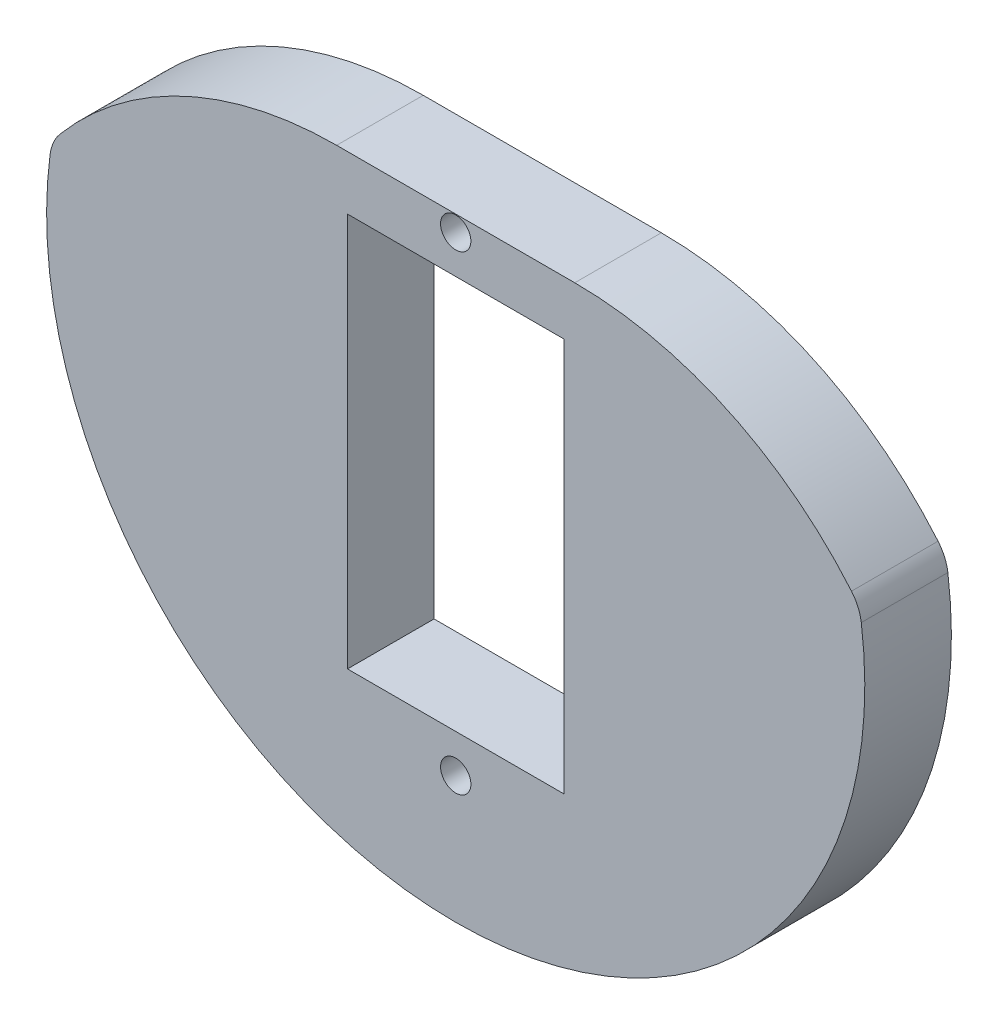
ISO-10303-21;
HEADER;
FILE_DESCRIPTION(('STEP AP214'),'2;1');
FILE_NAME('part.step','',(''),(''),'','','');
FILE_SCHEMA(('AUTOMOTIVE_DESIGN { 1 0 10303 214 1 1 1 1 }'));
ENDSEC;
DATA;
#1=APPLICATION_CONTEXT('core data for automotive mechanical design processes');
#2=APPLICATION_PROTOCOL_DEFINITION('international standard','automotive_design',2000,#1);
#3=PRODUCT_CONTEXT('',#1,'mechanical');
#4=PRODUCT('Part','Part','',(#3));
#5=PRODUCT_RELATED_PRODUCT_CATEGORY('part','',(#4));
#6=PRODUCT_DEFINITION_FORMATION('','',#4);
#7=PRODUCT_DEFINITION_CONTEXT('part definition',#1,'design');
#8=PRODUCT_DEFINITION('design','',#6,#7);
#9=PRODUCT_DEFINITION_SHAPE('','',#8);
#10=(LENGTH_UNIT() NAMED_UNIT(*) SI_UNIT(.MILLI.,.METRE.));
#11=(NAMED_UNIT(*) PLANE_ANGLE_UNIT() SI_UNIT($,.RADIAN.));
#12=(NAMED_UNIT(*) SI_UNIT($,.STERADIAN.) SOLID_ANGLE_UNIT());
#13=UNCERTAINTY_MEASURE_WITH_UNIT(LENGTH_MEASURE(1.E-05),#10,'distance_accuracy_value','');
#14=(GEOMETRIC_REPRESENTATION_CONTEXT(3) GLOBAL_UNCERTAINTY_ASSIGNED_CONTEXT((#13)) GLOBAL_UNIT_ASSIGNED_CONTEXT((#10,
#11,#12)) REPRESENTATION_CONTEXT('',''));
#15=CARTESIAN_POINT('',(0.,0.,0.));
#16=DIRECTION('',(0.,0.,1.));
#17=DIRECTION('',(1.,0.,0.));
#18=AXIS2_PLACEMENT_3D('',#15,#16,#17);
#19=CARTESIAN_POINT('',(6.985,-9.24256169381886,5.08));
#20=DIRECTION('',(0.,0.,-1.));
#21=DIRECTION('',(-1.,0.,0.));
#22=AXIS2_PLACEMENT_3D('',#19,#20,#21);
#23=CYLINDRICAL_SURFACE('',#22,21.2313616938189);
#24=CARTESIAN_POINT('',(6.985,-9.24256169381886,5.08));
#25=DIRECTION('',(0.,0.,1.));
#26=DIRECTION('',(-1.,0.,0.));
#27=AXIS2_PLACEMENT_3D('',#24,#25,#26);
#28=CIRCLE('',#27,21.2313616938189);
#29=CARTESIAN_POINT('',(23.2220252121452,4.43697527326889,5.08));
#30=VERTEX_POINT('',#29);
#31=CARTESIAN_POINT('',(6.985,11.9888,5.08));
#32=VERTEX_POINT('',#31);
#33=EDGE_CURVE('E170',#30,#32,#28,.T.);
#34=ORIENTED_EDGE('',*,*,#33,.F.);
#35=DIRECTION('',(0.,0.,-1.));
#36=VECTOR('',#35,1.);
#37=CARTESIAN_POINT('',(23.2220252121452,4.43697527326889,5.08));
#38=LINE('',#37,#36);
#39=CARTESIAN_POINT('',(23.2220252121452,4.43697527326889,0.));
#40=VERTEX_POINT('',#39);
#41=EDGE_CURVE('E11',#30,#40,#38,.T.);
#42=ORIENTED_EDGE('',*,*,#41,.T.);
#43=CARTESIAN_POINT('',(6.985,-9.24256169381886,0.));
#44=DIRECTION('',(0.,0.,1.));
#45=DIRECTION('',(-1.,0.,0.));
#46=AXIS2_PLACEMENT_3D('',#43,#44,#45);
#47=CIRCLE('',#46,21.2313616938189);
#48=CARTESIAN_POINT('',(6.985,11.9888,0.));
#49=VERTEX_POINT('',#48);
#50=EDGE_CURVE('E164',#40,#49,#47,.T.);
#51=ORIENTED_EDGE('',*,*,#50,.T.);
#52=DIRECTION('',(0.,0.,-1.));
#53=VECTOR('',#52,1.);
#54=CARTESIAN_POINT('',(6.985,11.9888,5.08));
#55=LINE('',#54,#53);
#56=EDGE_CURVE('E201',#32,#49,#55,.T.);
#57=ORIENTED_EDGE('',*,*,#56,.F.);
#58=EDGE_LOOP('',(#34,#42,#51,#57));
#59=FACE_BOUND('',#58,.T.);
#60=ADVANCED_FACE('F39',(#59),#23,.T.);
#61=CARTESIAN_POINT('',(-6.985,11.9888,5.08));
#62=DIRECTION('',(0.,-1.,0.));
#63=DIRECTION('',(0.,0.,-1.));
#64=AXIS2_PLACEMENT_3D('',#61,#62,#63);
#65=PLANE('',#64);
#66=DIRECTION('',(-1.,0.,0.));
#67=VECTOR('',#66,1.);
#68=CARTESIAN_POINT('',(-6.985,11.9888,0.));
#69=LINE('',#68,#67);
#70=CARTESIAN_POINT('',(-6.985,11.9888,0.));
#71=VERTEX_POINT('',#70);
#72=EDGE_CURVE('E188',#49,#71,#69,.T.);
#73=ORIENTED_EDGE('',*,*,#72,.T.);
#74=DIRECTION('',(0.,0.,-1.));
#75=VECTOR('',#74,1.);
#76=CARTESIAN_POINT('',(-6.985,11.9888,5.08));
#77=LINE('',#76,#75);
#78=CARTESIAN_POINT('',(-6.985,11.9888,5.08));
#79=VERTEX_POINT('',#78);
#80=EDGE_CURVE('E185',#79,#71,#77,.T.);
#81=ORIENTED_EDGE('',*,*,#80,.F.);
#82=DIRECTION('',(-1.,0.,0.));
#83=VECTOR('',#82,1.);
#84=CARTESIAN_POINT('',(-6.985,11.9888,5.08));
#85=LINE('',#84,#83);
#86=EDGE_CURVE('E173',#32,#79,#85,.T.);
#87=ORIENTED_EDGE('',*,*,#86,.F.);
#88=ORIENTED_EDGE('',*,*,#56,.T.);
#89=EDGE_LOOP('',(#73,#81,#87,#88));
#90=FACE_BOUND('',#89,.T.);
#91=ADVANCED_FACE('F245',(#90),#65,.F.);
#92=CARTESIAN_POINT('',(-6.985,-9.24256169381886,5.08));
#93=DIRECTION('',(0.,0.,-1.));
#94=DIRECTION('',(-1.,0.,0.));
#95=AXIS2_PLACEMENT_3D('',#92,#93,#94);
#96=CYLINDRICAL_SURFACE('',#95,21.2313616938189);
#97=CARTESIAN_POINT('',(-6.985,-9.24256169381886,0.));
#98=DIRECTION('',(0.,0.,1.));
#99=DIRECTION('',(1.,0.,0.));
#100=AXIS2_PLACEMENT_3D('',#97,#98,#99);
#101=CIRCLE('',#100,21.2313616938189);
#102=CARTESIAN_POINT('',(-23.2220252121452,4.43697527326889,0.));
#103=VERTEX_POINT('',#102);
#104=EDGE_CURVE('E191',#71,#103,#101,.T.);
#105=ORIENTED_EDGE('',*,*,#104,.T.);
#106=DIRECTION('',(0.,0.,-1.));
#107=VECTOR('',#106,1.);
#108=CARTESIAN_POINT('',(-23.2220252121452,4.43697527326889,5.08));
#109=LINE('',#108,#107);
#110=CARTESIAN_POINT('',(-23.2220252121452,4.43697527326889,5.08));
#111=VERTEX_POINT('',#110);
#112=EDGE_CURVE('E218',#103,#111,#109,.F.);
#113=ORIENTED_EDGE('',*,*,#112,.T.);
#114=CARTESIAN_POINT('',(-6.985,-9.24256169381886,5.08));
#115=DIRECTION('',(0.,0.,1.));
#116=DIRECTION('',(1.,0.,0.));
#117=AXIS2_PLACEMENT_3D('',#114,#115,#116);
#118=CIRCLE('',#117,21.2313616938189);
#119=EDGE_CURVE('E177',#79,#111,#118,.T.);
#120=ORIENTED_EDGE('',*,*,#119,.F.);
#121=ORIENTED_EDGE('',*,*,#80,.T.);
#122=EDGE_LOOP('',(#105,#113,#120,#121));
#123=FACE_BOUND('',#122,.T.);
#124=ADVANCED_FACE('F241',(#123),#96,.T.);
#125=CARTESIAN_POINT('',(0.,0.,5.08));
#126=DIRECTION('',(0.,0.,-1.));
#127=DIRECTION('',(-1.,0.,0.));
#128=AXIS2_PLACEMENT_3D('',#125,#126,#127);
#129=CYLINDRICAL_SURFACE('',#128,24.003);
#130=CARTESIAN_POINT('',(0.,0.,5.08));
#131=DIRECTION('',(0.,0.,1.));
#132=DIRECTION('',(1.,0.,0.));
#133=AXIS2_PLACEMENT_3D('',#130,#131,#132);
#134=CIRCLE('',#133,24.003);
#135=CARTESIAN_POINT('',(-23.7978056906165,3.13184503314895,5.08));
#136=VERTEX_POINT('',#135);
#137=CARTESIAN_POINT('',(23.7978056906165,3.13184503314895,5.08));
#138=VERTEX_POINT('',#137);
#139=EDGE_CURVE('E181',#136,#138,#134,.T.);
#140=ORIENTED_EDGE('',*,*,#139,.F.);
#141=DIRECTION('',(0.,0.,-1.));
#142=VECTOR('',#141,1.);
#143=CARTESIAN_POINT('',(-23.7978056906165,3.13184503314895,5.08));
#144=LINE('',#143,#142);
#145=CARTESIAN_POINT('',(-23.7978056906165,3.13184503314895,0.));
#146=VERTEX_POINT('',#145);
#147=EDGE_CURVE('E208',#136,#146,#144,.T.);
#148=ORIENTED_EDGE('',*,*,#147,.T.);
#149=CARTESIAN_POINT('',(0.,0.,0.));
#150=DIRECTION('',(0.,0.,1.));
#151=DIRECTION('',(1.,0.,0.));
#152=AXIS2_PLACEMENT_3D('',#149,#150,#151);
#153=CIRCLE('',#152,24.003);
#154=CARTESIAN_POINT('',(23.7978056906165,3.13184503314895,0.));
#155=VERTEX_POINT('',#154);
#156=EDGE_CURVE('E174',#146,#155,#153,.T.);
#157=ORIENTED_EDGE('',*,*,#156,.T.);
#158=DIRECTION('',(0.,0.,-1.));
#159=VECTOR('',#158,1.);
#160=CARTESIAN_POINT('',(23.7978056906165,3.13184503314895,5.08));
#161=LINE('',#160,#159);
#162=EDGE_CURVE('E205',#155,#138,#161,.F.);
#163=ORIENTED_EDGE('',*,*,#162,.T.);
#164=EDGE_LOOP('',(#140,#148,#157,#163));
#165=FACE_BOUND('',#164,.T.);
#166=ADVANCED_FACE('F234',(#165),#129,.T.);
#167=CARTESIAN_POINT('',(6.985,-9.24256169381886,5.08));
#168=DIRECTION('',(0.,0.,-1.));
#169=DIRECTION('',(-1.,0.,0.));
#170=AXIS2_PLACEMENT_3D('',#167,#168,#169);
#171=PLANE('',#170);
#172=CARTESIAN_POINT('',(0.,11.05535,5.08));
#173=DIRECTION('',(0.,0.,1.));
#174=DIRECTION('',(1.,0.,0.));
#175=AXIS2_PLACEMENT_3D('',#172,#173,#174);
#176=CIRCLE('',#175,0.888999999999999);
#177=CARTESIAN_POINT('',(0.888999999999999,11.05535,5.08));
#178=VERTEX_POINT('',#177);
#179=EDGE_CURVE('E145',#178,#178,#176,.T.);
#180=ORIENTED_EDGE('',*,*,#179,.F.);
#181=EDGE_LOOP('',(#180));
#182=FACE_BOUND('',#181,.T.);
#183=CARTESIAN_POINT('',(0.,-16.54175,5.08));
#184=DIRECTION('',(0.,0.,1.));
#185=DIRECTION('',(1.,0.,0.));
#186=AXIS2_PLACEMENT_3D('',#183,#184,#185);
#187=CIRCLE('',#186,0.889);
#188=CARTESIAN_POINT('',(0.889,-16.54175,5.08));
#189=VERTEX_POINT('',#188);
#190=EDGE_CURVE('E298',#189,#189,#187,.T.);
#191=ORIENTED_EDGE('',*,*,#190,.F.);
#192=EDGE_LOOP('',(#191));
#193=FACE_BOUND('',#192,.T.);
#194=DIRECTION('',(1.,0.,0.));
#195=VECTOR('',#194,1.);
#196=CARTESIAN_POINT('',(-6.35,-14.3002,5.08));
#197=LINE('',#196,#195);
#198=CARTESIAN_POINT('',(-6.35,-14.3002,5.08));
#199=VERTEX_POINT('',#198);
#200=CARTESIAN_POINT('',(6.35,-14.3002,5.08));
#201=VERTEX_POINT('',#200);
#202=EDGE_CURVE('E154',#199,#201,#197,.T.);
#203=ORIENTED_EDGE('',*,*,#202,.F.);
#204=DIRECTION('',(0.,-1.,0.));
#205=VECTOR('',#204,1.);
#206=CARTESIAN_POINT('',(-6.35,8.81380000000001,5.08));
#207=LINE('',#206,#205);
#208=CARTESIAN_POINT('',(-6.35,8.81380000000001,5.08));
#209=VERTEX_POINT('',#208);
#210=EDGE_CURVE('E55',#209,#199,#207,.T.);
#211=ORIENTED_EDGE('',*,*,#210,.F.);
#212=DIRECTION('',(-1.,0.,0.));
#213=VECTOR('',#212,1.);
#214=CARTESIAN_POINT('',(-6.35,8.81380000000001,5.08));
#215=LINE('',#214,#213);
#216=CARTESIAN_POINT('',(6.35,8.81380000000001,5.08));
#217=VERTEX_POINT('',#216);
#218=EDGE_CURVE('E138',#217,#209,#215,.T.);
#219=ORIENTED_EDGE('',*,*,#218,.F.);
#220=DIRECTION('',(0.,1.,0.));
#221=VECTOR('',#220,1.);
#222=CARTESIAN_POINT('',(6.35,8.81380000000001,5.08));
#223=LINE('',#222,#221);
#224=EDGE_CURVE('E142',#201,#217,#223,.T.);
#225=ORIENTED_EDGE('',*,*,#224,.F.);
#226=EDGE_LOOP('',(#203,#211,#219,#225));
#227=FACE_BOUND('',#226,.T.);
#228=ORIENTED_EDGE('',*,*,#119,.T.);
#229=CARTESIAN_POINT('',(-21.2795193741492,2.80043286032895,5.08));
#230=DIRECTION('',(0.,0.,-1.));
#231=DIRECTION('',(-1.,0.,0.));
#232=AXIS2_PLACEMENT_3D('',#229,#230,#231);
#233=CIRCLE('',#232,2.54);
#234=EDGE_CURVE('E48',#111,#136,#233,.F.);
#235=ORIENTED_EDGE('',*,*,#234,.T.);
#236=ORIENTED_EDGE('',*,*,#139,.T.);
#237=CARTESIAN_POINT('',(21.2795193741492,2.80043286032895,5.08));
#238=DIRECTION('',(0.,0.,-1.));
#239=DIRECTION('',(-1.,0.,0.));
#240=AXIS2_PLACEMENT_3D('',#237,#238,#239);
#241=CIRCLE('',#240,2.54);
#242=EDGE_CURVE('E221',#138,#30,#241,.F.);
#243=ORIENTED_EDGE('',*,*,#242,.T.);
#244=ORIENTED_EDGE('',*,*,#33,.T.);
#245=ORIENTED_EDGE('',*,*,#86,.T.);
#246=EDGE_LOOP('',(#228,#235,#236,#243,#244,#245));
#247=FACE_BOUND('',#246,.T.);
#248=ADVANCED_FACE('F227',(#182,#193,#227,#247),#171,.F.);
#249=CARTESIAN_POINT('',(6.985,-9.24256169381886,0.));
#250=DIRECTION('',(0.,0.,-1.));
#251=DIRECTION('',(-1.,0.,0.));
#252=AXIS2_PLACEMENT_3D('',#249,#250,#251);
#253=PLANE('',#252);
#254=CARTESIAN_POINT('',(0.,11.05535,0.));
#255=DIRECTION('',(0.,0.,1.));
#256=DIRECTION('',(1.,0.,0.));
#257=AXIS2_PLACEMENT_3D('',#254,#255,#256);
#258=CIRCLE('',#257,0.888999999999999);
#259=CARTESIAN_POINT('',(0.888999999999999,11.05535,0.));
#260=VERTEX_POINT('',#259);
#261=EDGE_CURVE('E301',#260,#260,#258,.T.);
#262=ORIENTED_EDGE('',*,*,#261,.T.);
#263=EDGE_LOOP('',(#262));
#264=FACE_BOUND('',#263,.T.);
#265=CARTESIAN_POINT('',(0.,-16.54175,0.));
#266=DIRECTION('',(0.,0.,1.));
#267=DIRECTION('',(1.,0.,0.));
#268=AXIS2_PLACEMENT_3D('',#265,#266,#267);
#269=CIRCLE('',#268,0.889);
#270=CARTESIAN_POINT('',(0.889,-16.54175,0.));
#271=VERTEX_POINT('',#270);
#272=EDGE_CURVE('E155',#271,#271,#269,.T.);
#273=ORIENTED_EDGE('',*,*,#272,.T.);
#274=EDGE_LOOP('',(#273));
#275=FACE_BOUND('',#274,.T.);
#276=DIRECTION('',(0.,-1.,0.));
#277=VECTOR('',#276,1.);
#278=CARTESIAN_POINT('',(-6.35,8.81380000000001,0.));
#279=LINE('',#278,#277);
#280=CARTESIAN_POINT('',(-6.35,8.81380000000001,0.));
#281=VERTEX_POINT('',#280);
#282=CARTESIAN_POINT('',(-6.35,-14.3002,0.));
#283=VERTEX_POINT('',#282);
#284=EDGE_CURVE('E119',#281,#283,#279,.T.);
#285=ORIENTED_EDGE('',*,*,#284,.T.);
#286=DIRECTION('',(1.,0.,0.));
#287=VECTOR('',#286,1.);
#288=CARTESIAN_POINT('',(-6.35,-14.3002,0.));
#289=LINE('',#288,#287);
#290=CARTESIAN_POINT('',(6.35,-14.3002,0.));
#291=VERTEX_POINT('',#290);
#292=EDGE_CURVE('E129',#283,#291,#289,.T.);
#293=ORIENTED_EDGE('',*,*,#292,.T.);
#294=DIRECTION('',(0.,1.,0.));
#295=VECTOR('',#294,1.);
#296=CARTESIAN_POINT('',(6.35,8.81380000000001,0.));
#297=LINE('',#296,#295);
#298=CARTESIAN_POINT('',(6.35,8.81380000000001,0.));
#299=VERTEX_POINT('',#298);
#300=EDGE_CURVE('E63',#291,#299,#297,.T.);
#301=ORIENTED_EDGE('',*,*,#300,.T.);
#302=DIRECTION('',(-1.,0.,0.));
#303=VECTOR('',#302,1.);
#304=CARTESIAN_POINT('',(-6.35,8.81380000000001,0.));
#305=LINE('',#304,#303);
#306=EDGE_CURVE('E126',#299,#281,#305,.T.);
#307=ORIENTED_EDGE('',*,*,#306,.T.);
#308=EDGE_LOOP('',(#285,#293,#301,#307));
#309=FACE_BOUND('',#308,.T.);
#310=ORIENTED_EDGE('',*,*,#156,.F.);
#311=CARTESIAN_POINT('',(-21.2795193741492,2.80043286032895,0.));
#312=DIRECTION('',(0.,0.,-1.));
#313=DIRECTION('',(-1.,0.,0.));
#314=AXIS2_PLACEMENT_3D('',#311,#312,#313);
#315=CIRCLE('',#314,2.54);
#316=EDGE_CURVE('E215',#146,#103,#315,.T.);
#317=ORIENTED_EDGE('',*,*,#316,.T.);
#318=ORIENTED_EDGE('',*,*,#104,.F.);
#319=ORIENTED_EDGE('',*,*,#72,.F.);
#320=ORIENTED_EDGE('',*,*,#50,.F.);
#321=CARTESIAN_POINT('',(21.2795193741492,2.80043286032895,0.));
#322=DIRECTION('',(0.,0.,-1.));
#323=DIRECTION('',(-1.,0.,0.));
#324=AXIS2_PLACEMENT_3D('',#321,#322,#323);
#325=CIRCLE('',#324,2.54);
#326=EDGE_CURVE('E212',#40,#155,#325,.T.);
#327=ORIENTED_EDGE('',*,*,#326,.T.);
#328=EDGE_LOOP('',(#310,#317,#318,#319,#320,#327));
#329=FACE_BOUND('',#328,.T.);
#330=ADVANCED_FACE('F134',(#264,#275,#309,#329),#253,.T.);
#331=CARTESIAN_POINT('',(-21.2795193741492,2.80043286032895,5.08));
#332=DIRECTION('',(0.,0.,-1.));
#333=DIRECTION('',(-1.,0.,0.));
#334=AXIS2_PLACEMENT_3D('',#331,#332,#333);
#335=CYLINDRICAL_SURFACE('',#334,2.54);
#336=ORIENTED_EDGE('',*,*,#234,.F.);
#337=ORIENTED_EDGE('',*,*,#112,.F.);
#338=ORIENTED_EDGE('',*,*,#316,.F.);
#339=ORIENTED_EDGE('',*,*,#147,.F.);
#340=EDGE_LOOP('',(#336,#337,#338,#339));
#341=FACE_BOUND('',#340,.T.);
#342=ADVANCED_FACE('F237',(#341),#335,.T.);
#343=CARTESIAN_POINT('',(21.2795193741492,2.80043286032895,5.08));
#344=DIRECTION('',(0.,0.,-1.));
#345=DIRECTION('',(-1.,0.,0.));
#346=AXIS2_PLACEMENT_3D('',#343,#344,#345);
#347=CYLINDRICAL_SURFACE('',#346,2.54);
#348=ORIENTED_EDGE('',*,*,#242,.F.);
#349=ORIENTED_EDGE('',*,*,#162,.F.);
#350=ORIENTED_EDGE('',*,*,#326,.F.);
#351=ORIENTED_EDGE('',*,*,#41,.F.);
#352=EDGE_LOOP('',(#348,#349,#350,#351));
#353=FACE_BOUND('',#352,.T.);
#354=ADVANCED_FACE('F41',(#353),#347,.T.);
#355=CARTESIAN_POINT('',(-6.35,8.81380000000001,0.));
#356=DIRECTION('',(-1.,0.,0.));
#357=DIRECTION('',(0.,0.,1.));
#358=AXIS2_PLACEMENT_3D('',#355,#356,#357);
#359=PLANE('',#358);
#360=ORIENTED_EDGE('',*,*,#210,.T.);
#361=DIRECTION('',(0.,0.,1.));
#362=VECTOR('',#361,1.);
#363=CARTESIAN_POINT('',(-6.35,-14.3002,0.));
#364=LINE('',#363,#362);
#365=EDGE_CURVE('E115',#283,#199,#364,.T.);
#366=ORIENTED_EDGE('',*,*,#365,.F.);
#367=ORIENTED_EDGE('',*,*,#284,.F.);
#368=DIRECTION('',(0.,0.,1.));
#369=VECTOR('',#368,1.);
#370=CARTESIAN_POINT('',(-6.35,8.81380000000001,0.));
#371=LINE('',#370,#369);
#372=EDGE_CURVE('E161',#281,#209,#371,.T.);
#373=ORIENTED_EDGE('',*,*,#372,.T.);
#374=EDGE_LOOP('',(#360,#366,#367,#373));
#375=FACE_BOUND('',#374,.T.);
#376=ADVANCED_FACE('F117',(#375),#359,.F.);
#377=CARTESIAN_POINT('',(-6.35,8.81380000000001,0.));
#378=DIRECTION('',(0.,1.,0.));
#379=DIRECTION('',(0.,0.,1.));
#380=AXIS2_PLACEMENT_3D('',#377,#378,#379);
#381=PLANE('',#380);
#382=ORIENTED_EDGE('',*,*,#218,.T.);
#383=ORIENTED_EDGE('',*,*,#372,.F.);
#384=ORIENTED_EDGE('',*,*,#306,.F.);
#385=DIRECTION('',(0.,0.,1.));
#386=VECTOR('',#385,1.);
#387=CARTESIAN_POINT('',(6.35,8.81380000000001,0.));
#388=LINE('',#387,#386);
#389=EDGE_CURVE('E165',#299,#217,#388,.T.);
#390=ORIENTED_EDGE('',*,*,#389,.T.);
#391=EDGE_LOOP('',(#382,#383,#384,#390));
#392=FACE_BOUND('',#391,.T.);
#393=ADVANCED_FACE('F257',(#392),#381,.F.);
#394=CARTESIAN_POINT('',(6.35,8.81380000000001,0.));
#395=DIRECTION('',(1.,0.,0.));
#396=DIRECTION('',(0.,0.,-1.));
#397=AXIS2_PLACEMENT_3D('',#394,#395,#396);
#398=PLANE('',#397);
#399=ORIENTED_EDGE('',*,*,#224,.T.);
#400=ORIENTED_EDGE('',*,*,#389,.F.);
#401=ORIENTED_EDGE('',*,*,#300,.F.);
#402=DIRECTION('',(0.,0.,1.));
#403=VECTOR('',#402,1.);
#404=CARTESIAN_POINT('',(6.35,-14.3002,0.));
#405=LINE('',#404,#403);
#406=EDGE_CURVE('E125',#291,#201,#405,.T.);
#407=ORIENTED_EDGE('',*,*,#406,.T.);
#408=EDGE_LOOP('',(#399,#400,#401,#407));
#409=FACE_BOUND('',#408,.T.);
#410=ADVANCED_FACE('F279',(#409),#398,.F.);
#411=CARTESIAN_POINT('',(-6.35,-14.3002,0.));
#412=DIRECTION('',(0.,-1.,0.));
#413=DIRECTION('',(0.,0.,-1.));
#414=AXIS2_PLACEMENT_3D('',#411,#412,#413);
#415=PLANE('',#414);
#416=ORIENTED_EDGE('',*,*,#202,.T.);
#417=ORIENTED_EDGE('',*,*,#406,.F.);
#418=ORIENTED_EDGE('',*,*,#292,.F.);
#419=ORIENTED_EDGE('',*,*,#365,.T.);
#420=EDGE_LOOP('',(#416,#417,#418,#419));
#421=FACE_BOUND('',#420,.T.);
#422=ADVANCED_FACE('F130',(#421),#415,.F.);
#423=CARTESIAN_POINT('',(0.,-16.54175,0.));
#424=DIRECTION('',(0.,0.,1.));
#425=DIRECTION('',(1.,0.,0.));
#426=AXIS2_PLACEMENT_3D('',#423,#424,#425);
#427=CYLINDRICAL_SURFACE('',#426,0.889);
#428=ORIENTED_EDGE('',*,*,#272,.F.);
#429=EDGE_LOOP('',(#428));
#430=FACE_BOUND('',#429,.T.);
#431=ORIENTED_EDGE('',*,*,#190,.T.);
#432=EDGE_LOOP('',(#431));
#433=FACE_BOUND('',#432,.T.);
#434=ADVANCED_FACE('F278',(#430,#433),#427,.F.);
#435=CARTESIAN_POINT('',(0.,11.05535,0.));
#436=DIRECTION('',(0.,0.,1.));
#437=DIRECTION('',(1.,0.,0.));
#438=AXIS2_PLACEMENT_3D('',#435,#436,#437);
#439=CYLINDRICAL_SURFACE('',#438,0.888999999999999);
#440=ORIENTED_EDGE('',*,*,#261,.F.);
#441=EDGE_LOOP('',(#440));
#442=FACE_BOUND('',#441,.T.);
#443=ORIENTED_EDGE('',*,*,#179,.T.);
#444=EDGE_LOOP('',(#443));
#445=FACE_BOUND('',#444,.T.);
#446=ADVANCED_FACE('F285',(#442,#445),#439,.F.);
#447=CLOSED_SHELL('',(#60,#91,#124,#166,#248,#330,#342,#354,#376,#393,#410,#422,#434,#446));
#448=MANIFOLD_SOLID_BREP('B2',#447);
#449=ADVANCED_BREP_SHAPE_REPRESENTATION('',(#18,#448),#14);
#450=SHAPE_DEFINITION_REPRESENTATION(#9,#449);
ENDSEC;
END-ISO-10303-21;
